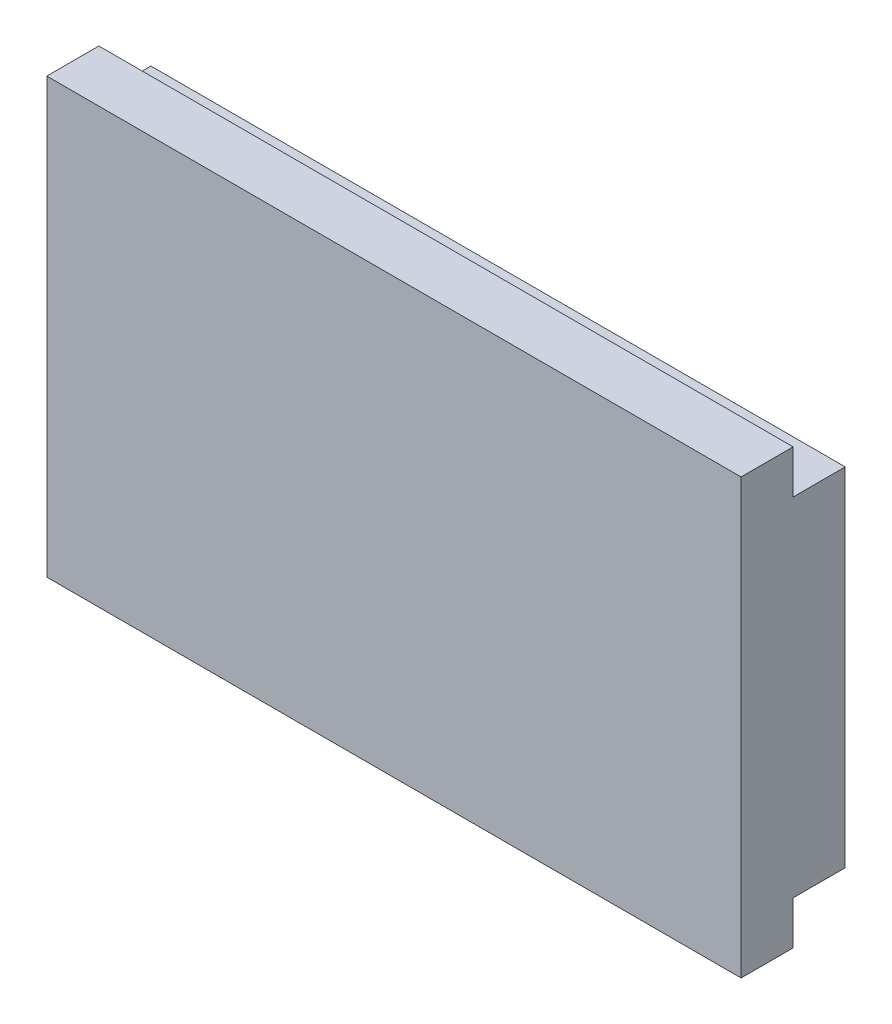
ISO-10303-21;
HEADER;
FILE_DESCRIPTION(('STEP AP214'),'2;1');
FILE_NAME('part.step','',(''),(''),'','','');
FILE_SCHEMA(('AUTOMOTIVE_DESIGN { 1 0 10303 214 1 1 1 1 }'));
ENDSEC;
DATA;
#1=APPLICATION_CONTEXT('core data for automotive mechanical design processes');
#2=APPLICATION_PROTOCOL_DEFINITION('international standard','automotive_design',2000,#1);
#3=PRODUCT_CONTEXT('',#1,'mechanical');
#4=PRODUCT('Part','Part','',(#3));
#5=PRODUCT_RELATED_PRODUCT_CATEGORY('part','',(#4));
#6=PRODUCT_DEFINITION_FORMATION('','',#4);
#7=PRODUCT_DEFINITION_CONTEXT('part definition',#1,'design');
#8=PRODUCT_DEFINITION('design','',#6,#7);
#9=PRODUCT_DEFINITION_SHAPE('','',#8);
#10=(LENGTH_UNIT() NAMED_UNIT(*) SI_UNIT(.MILLI.,.METRE.));
#11=(NAMED_UNIT(*) PLANE_ANGLE_UNIT() SI_UNIT($,.RADIAN.));
#12=(NAMED_UNIT(*) SI_UNIT($,.STERADIAN.) SOLID_ANGLE_UNIT());
#13=UNCERTAINTY_MEASURE_WITH_UNIT(LENGTH_MEASURE(1.E-05),#10,'distance_accuracy_value','');
#14=(GEOMETRIC_REPRESENTATION_CONTEXT(3) GLOBAL_UNCERTAINTY_ASSIGNED_CONTEXT((#13)) GLOBAL_UNIT_ASSIGNED_CONTEXT((#10,
#11,#12)) REPRESENTATION_CONTEXT('',''));
#15=CARTESIAN_POINT('',(0.,0.,0.));
#16=DIRECTION('',(0.,0.,1.));
#17=DIRECTION('',(1.,0.,0.));
#18=AXIS2_PLACEMENT_3D('',#15,#16,#17);
#19=CARTESIAN_POINT('',(0.,0.,0.));
#20=DIRECTION('',(0.,0.,1.));
#21=DIRECTION('',(1.,0.,0.));
#22=AXIS2_PLACEMENT_3D('',#19,#20,#21);
#23=PLANE('',#22);
#24=DIRECTION('',(0.,-1.,0.));
#25=VECTOR('',#24,1.);
#26=CARTESIAN_POINT('',(-40.,20.,0.));
#27=LINE('',#26,#25);
#28=CARTESIAN_POINT('',(-40.,20.,0.));
#29=VERTEX_POINT('',#28);
#30=CARTESIAN_POINT('',(-40.,-20.,0.));
#31=VERTEX_POINT('',#30);
#32=EDGE_CURVE('E152',#29,#31,#27,.T.);
#33=ORIENTED_EDGE('',*,*,#32,.F.);
#34=DIRECTION('',(-1.,0.,0.));
#35=VECTOR('',#34,1.);
#36=CARTESIAN_POINT('',(40.,20.,0.));
#37=LINE('',#36,#35);
#38=CARTESIAN_POINT('',(40.,20.,0.));
#39=VERTEX_POINT('',#38);
#40=EDGE_CURVE('E10',#39,#29,#37,.T.);
#41=ORIENTED_EDGE('',*,*,#40,.F.);
#42=DIRECTION('',(0.,1.,0.));
#43=VECTOR('',#42,1.);
#44=CARTESIAN_POINT('',(40.,-20.,0.));
#45=LINE('',#44,#43);
#46=CARTESIAN_POINT('',(40.,-20.,0.));
#47=VERTEX_POINT('',#46);
#48=EDGE_CURVE('E153',#47,#39,#45,.T.);
#49=ORIENTED_EDGE('',*,*,#48,.F.);
#50=DIRECTION('',(1.,0.,0.));
#51=VECTOR('',#50,1.);
#52=CARTESIAN_POINT('',(-40.,-20.,0.));
#53=LINE('',#52,#51);
#54=EDGE_CURVE('E26',#31,#47,#53,.T.);
#55=ORIENTED_EDGE('',*,*,#54,.F.);
#56=EDGE_LOOP('',(#33,#41,#49,#55));
#57=FACE_BOUND('',#56,.T.);
#58=ADVANCED_FACE('F16',(#57),#23,.F.);
#59=CARTESIAN_POINT('',(40.,20.,0.));
#60=DIRECTION('',(0.,-1.,0.));
#61=DIRECTION('',(0.,0.,-1.));
#62=AXIS2_PLACEMENT_3D('',#59,#60,#61);
#63=PLANE('',#62);
#64=ORIENTED_EDGE('',*,*,#40,.T.);
#65=DIRECTION('',(0.,0.,1.));
#66=VECTOR('',#65,1.);
#67=CARTESIAN_POINT('',(-40.,20.,0.));
#68=LINE('',#67,#66);
#69=CARTESIAN_POINT('',(-40.,20.,6.));
#70=VERTEX_POINT('',#69);
#71=EDGE_CURVE('E149',#29,#70,#68,.T.);
#72=ORIENTED_EDGE('',*,*,#71,.T.);
#73=DIRECTION('',(-1.,0.,0.));
#74=VECTOR('',#73,1.);
#75=CARTESIAN_POINT('',(40.,20.,6.));
#76=LINE('',#75,#74);
#77=CARTESIAN_POINT('',(40.,20.,6.));
#78=VERTEX_POINT('',#77);
#79=EDGE_CURVE('E72',#78,#70,#76,.T.);
#80=ORIENTED_EDGE('',*,*,#79,.F.);
#81=DIRECTION('',(0.,0.,1.));
#82=VECTOR('',#81,1.);
#83=CARTESIAN_POINT('',(40.,20.,0.));
#84=LINE('',#83,#82);
#85=EDGE_CURVE('E157',#39,#78,#84,.T.);
#86=ORIENTED_EDGE('',*,*,#85,.F.);
#87=EDGE_LOOP('',(#64,#72,#80,#86));
#88=FACE_BOUND('',#87,.T.);
#89=ADVANCED_FACE('F18',(#88),#63,.F.);
#90=CARTESIAN_POINT('',(-40.,-20.,0.));
#91=DIRECTION('',(0.,1.,0.));
#92=DIRECTION('',(1.,0.,0.));
#93=AXIS2_PLACEMENT_3D('',#90,#91,#92);
#94=PLANE('',#93);
#95=ORIENTED_EDGE('',*,*,#54,.T.);
#96=DIRECTION('',(0.,0.,1.));
#97=VECTOR('',#96,1.);
#98=CARTESIAN_POINT('',(40.,-20.,0.));
#99=LINE('',#98,#97);
#100=CARTESIAN_POINT('',(40.,-20.,6.));
#101=VERTEX_POINT('',#100);
#102=EDGE_CURVE('E158',#47,#101,#99,.T.);
#103=ORIENTED_EDGE('',*,*,#102,.T.);
#104=DIRECTION('',(1.,0.,0.));
#105=VECTOR('',#104,1.);
#106=CARTESIAN_POINT('',(-40.,-20.,6.));
#107=LINE('',#106,#105);
#108=CARTESIAN_POINT('',(-40.,-20.,6.));
#109=VERTEX_POINT('',#108);
#110=EDGE_CURVE('E190',#109,#101,#107,.T.);
#111=ORIENTED_EDGE('',*,*,#110,.F.);
#112=DIRECTION('',(0.,0.,1.));
#113=VECTOR('',#112,1.);
#114=CARTESIAN_POINT('',(-40.,-20.,0.));
#115=LINE('',#114,#113);
#116=EDGE_CURVE('E118',#31,#109,#115,.T.);
#117=ORIENTED_EDGE('',*,*,#116,.F.);
#118=EDGE_LOOP('',(#95,#103,#111,#117));
#119=FACE_BOUND('',#118,.T.);
#120=ADVANCED_FACE('F199',(#119),#94,.F.);
#121=CARTESIAN_POINT('',(0.,0.,6.));
#122=DIRECTION('',(0.,0.,1.));
#123=DIRECTION('',(1.,0.,0.));
#124=AXIS2_PLACEMENT_3D('',#121,#122,#123);
#125=PLANE('',#124);
#126=DIRECTION('',(-1.,0.,0.));
#127=VECTOR('',#126,1.);
#128=CARTESIAN_POINT('',(40.,25.,6.));
#129=LINE('',#128,#127);
#130=CARTESIAN_POINT('',(40.,25.,6.));
#131=VERTEX_POINT('',#130);
#132=CARTESIAN_POINT('',(-40.,25.,6.));
#133=VERTEX_POINT('',#132);
#134=EDGE_CURVE('E173',#131,#133,#129,.T.);
#135=ORIENTED_EDGE('',*,*,#134,.F.);
#136=DIRECTION('',(0.,1.,0.));
#137=VECTOR('',#136,1.);
#138=CARTESIAN_POINT('',(40.,-25.,6.));
#139=LINE('',#138,#137);
#140=EDGE_CURVE('E179',#78,#131,#139,.T.);
#141=ORIENTED_EDGE('',*,*,#140,.F.);
#142=ORIENTED_EDGE('',*,*,#79,.T.);
#143=DIRECTION('',(0.,-1.,0.));
#144=VECTOR('',#143,1.);
#145=CARTESIAN_POINT('',(-40.,25.,6.));
#146=LINE('',#145,#144);
#147=EDGE_CURVE('E132',#133,#70,#146,.T.);
#148=ORIENTED_EDGE('',*,*,#147,.F.);
#149=EDGE_LOOP('',(#135,#141,#142,#148));
#150=FACE_BOUND('',#149,.T.);
#151=ADVANCED_FACE('F209',(#150),#125,.F.);
#152=CARTESIAN_POINT('',(40.,25.,6.));
#153=DIRECTION('',(0.,-1.,0.));
#154=DIRECTION('',(0.,0.,-1.));
#155=AXIS2_PLACEMENT_3D('',#152,#153,#154);
#156=PLANE('',#155);
#157=ORIENTED_EDGE('',*,*,#134,.T.);
#158=DIRECTION('',(0.,0.,1.));
#159=VECTOR('',#158,1.);
#160=CARTESIAN_POINT('',(-40.,25.,6.));
#161=LINE('',#160,#159);
#162=CARTESIAN_POINT('',(-40.,25.,12.));
#163=VERTEX_POINT('',#162);
#164=EDGE_CURVE('E166',#133,#163,#161,.T.);
#165=ORIENTED_EDGE('',*,*,#164,.T.);
#166=DIRECTION('',(-1.,0.,0.));
#167=VECTOR('',#166,1.);
#168=CARTESIAN_POINT('',(40.,25.,12.));
#169=LINE('',#168,#167);
#170=CARTESIAN_POINT('',(40.,25.,12.));
#171=VERTEX_POINT('',#170);
#172=EDGE_CURVE('E38',#171,#163,#169,.T.);
#173=ORIENTED_EDGE('',*,*,#172,.F.);
#174=DIRECTION('',(0.,0.,1.));
#175=VECTOR('',#174,1.);
#176=CARTESIAN_POINT('',(40.,25.,6.));
#177=LINE('',#176,#175);
#178=EDGE_CURVE('E183',#131,#171,#177,.T.);
#179=ORIENTED_EDGE('',*,*,#178,.F.);
#180=EDGE_LOOP('',(#157,#165,#173,#179));
#181=FACE_BOUND('',#180,.T.);
#182=ADVANCED_FACE('F222',(#181),#156,.F.);
#183=CARTESIAN_POINT('',(0.,0.,12.));
#184=DIRECTION('',(0.,0.,1.));
#185=DIRECTION('',(1.,0.,0.));
#186=AXIS2_PLACEMENT_3D('',#183,#184,#185);
#187=PLANE('',#186);
#188=DIRECTION('',(1.,0.,0.));
#189=VECTOR('',#188,1.);
#190=CARTESIAN_POINT('',(-40.,-25.,12.));
#191=LINE('',#190,#189);
#192=CARTESIAN_POINT('',(-40.,-25.,12.));
#193=VERTEX_POINT('',#192);
#194=CARTESIAN_POINT('',(40.,-25.,12.));
#195=VERTEX_POINT('',#194);
#196=EDGE_CURVE('E130',#193,#195,#191,.T.);
#197=ORIENTED_EDGE('',*,*,#196,.T.);
#198=DIRECTION('',(0.,1.,0.));
#199=VECTOR('',#198,1.);
#200=CARTESIAN_POINT('',(40.,-25.,12.));
#201=LINE('',#200,#199);
#202=EDGE_CURVE('E187',#195,#171,#201,.T.);
#203=ORIENTED_EDGE('',*,*,#202,.T.);
#204=ORIENTED_EDGE('',*,*,#172,.T.);
#205=DIRECTION('',(0.,-1.,0.));
#206=VECTOR('',#205,1.);
#207=CARTESIAN_POINT('',(-40.,25.,12.));
#208=LINE('',#207,#206);
#209=EDGE_CURVE('E122',#163,#193,#208,.T.);
#210=ORIENTED_EDGE('',*,*,#209,.T.);
#211=EDGE_LOOP('',(#197,#203,#204,#210));
#212=FACE_BOUND('',#211,.T.);
#213=ADVANCED_FACE('F204',(#212),#187,.T.);
#214=CARTESIAN_POINT('',(0.,0.,6.));
#215=DIRECTION('',(0.,0.,1.));
#216=DIRECTION('',(1.,0.,0.));
#217=AXIS2_PLACEMENT_3D('',#214,#215,#216);
#218=PLANE('',#217);
#219=ORIENTED_EDGE('',*,*,#110,.T.);
#220=DIRECTION('',(0.,1.,0.));
#221=VECTOR('',#220,1.);
#222=CARTESIAN_POINT('',(40.,-25.,6.));
#223=LINE('',#222,#221);
#224=CARTESIAN_POINT('',(40.,-25.,6.));
#225=VERTEX_POINT('',#224);
#226=EDGE_CURVE('E136',#225,#101,#223,.T.);
#227=ORIENTED_EDGE('',*,*,#226,.F.);
#228=DIRECTION('',(1.,0.,0.));
#229=VECTOR('',#228,1.);
#230=CARTESIAN_POINT('',(-40.,-25.,6.));
#231=LINE('',#230,#229);
#232=CARTESIAN_POINT('',(-40.,-25.,6.));
#233=VERTEX_POINT('',#232);
#234=EDGE_CURVE('E128',#233,#225,#231,.T.);
#235=ORIENTED_EDGE('',*,*,#234,.F.);
#236=DIRECTION('',(0.,-1.,0.));
#237=VECTOR('',#236,1.);
#238=CARTESIAN_POINT('',(-40.,25.,6.));
#239=LINE('',#238,#237);
#240=EDGE_CURVE('E109',#109,#233,#239,.T.);
#241=ORIENTED_EDGE('',*,*,#240,.F.);
#242=EDGE_LOOP('',(#219,#227,#235,#241));
#243=FACE_BOUND('',#242,.T.);
#244=ADVANCED_FACE('F134',(#243),#218,.F.);
#245=CARTESIAN_POINT('',(40.,-25.,6.));
#246=DIRECTION('',(-1.,0.,0.));
#247=DIRECTION('',(0.,0.,1.));
#248=AXIS2_PLACEMENT_3D('',#245,#246,#247);
#249=PLANE('',#248);
#250=ORIENTED_EDGE('',*,*,#226,.T.);
#251=ORIENTED_EDGE('',*,*,#102,.F.);
#252=ORIENTED_EDGE('',*,*,#48,.T.);
#253=ORIENTED_EDGE('',*,*,#85,.T.);
#254=ORIENTED_EDGE('',*,*,#140,.T.);
#255=ORIENTED_EDGE('',*,*,#178,.T.);
#256=ORIENTED_EDGE('',*,*,#202,.F.);
#257=DIRECTION('',(0.,0.,1.));
#258=VECTOR('',#257,1.);
#259=CARTESIAN_POINT('',(40.,-25.,6.));
#260=LINE('',#259,#258);
#261=EDGE_CURVE('E139',#225,#195,#260,.T.);
#262=ORIENTED_EDGE('',*,*,#261,.F.);
#263=EDGE_LOOP('',(#250,#251,#252,#253,#254,#255,#256,#262));
#264=FACE_BOUND('',#263,.T.);
#265=ADVANCED_FACE('F202',(#264),#249,.F.);
#266=CARTESIAN_POINT('',(-40.,25.,6.));
#267=DIRECTION('',(1.,0.,0.));
#268=DIRECTION('',(0.,1.,0.));
#269=AXIS2_PLACEMENT_3D('',#266,#267,#268);
#270=PLANE('',#269);
#271=ORIENTED_EDGE('',*,*,#147,.T.);
#272=ORIENTED_EDGE('',*,*,#71,.F.);
#273=ORIENTED_EDGE('',*,*,#32,.T.);
#274=ORIENTED_EDGE('',*,*,#116,.T.);
#275=ORIENTED_EDGE('',*,*,#240,.T.);
#276=DIRECTION('',(0.,0.,1.));
#277=VECTOR('',#276,1.);
#278=CARTESIAN_POINT('',(-40.,-25.,6.));
#279=LINE('',#278,#277);
#280=EDGE_CURVE('E114',#233,#193,#279,.T.);
#281=ORIENTED_EDGE('',*,*,#280,.T.);
#282=ORIENTED_EDGE('',*,*,#209,.F.);
#283=ORIENTED_EDGE('',*,*,#164,.F.);
#284=EDGE_LOOP('',(#271,#272,#273,#274,#275,#281,#282,#283));
#285=FACE_BOUND('',#284,.T.);
#286=ADVANCED_FACE('F112',(#285),#270,.F.);
#287=CARTESIAN_POINT('',(-40.,-25.,6.));
#288=DIRECTION('',(0.,1.,0.));
#289=DIRECTION('',(1.,0.,0.));
#290=AXIS2_PLACEMENT_3D('',#287,#288,#289);
#291=PLANE('',#290);
#292=ORIENTED_EDGE('',*,*,#234,.T.);
#293=ORIENTED_EDGE('',*,*,#261,.T.);
#294=ORIENTED_EDGE('',*,*,#196,.F.);
#295=ORIENTED_EDGE('',*,*,#280,.F.);
#296=EDGE_LOOP('',(#292,#293,#294,#295));
#297=FACE_BOUND('',#296,.T.);
#298=ADVANCED_FACE('F126',(#297),#291,.F.);
#299=CLOSED_SHELL('',(#58,#89,#120,#151,#182,#213,#244,#265,#286,#298));
#300=MANIFOLD_SOLID_BREP('B1',#299);
#301=ADVANCED_BREP_SHAPE_REPRESENTATION('',(#18,#300),#14);
#302=SHAPE_DEFINITION_REPRESENTATION(#9,#301);
ENDSEC;
END-ISO-10303-21;
